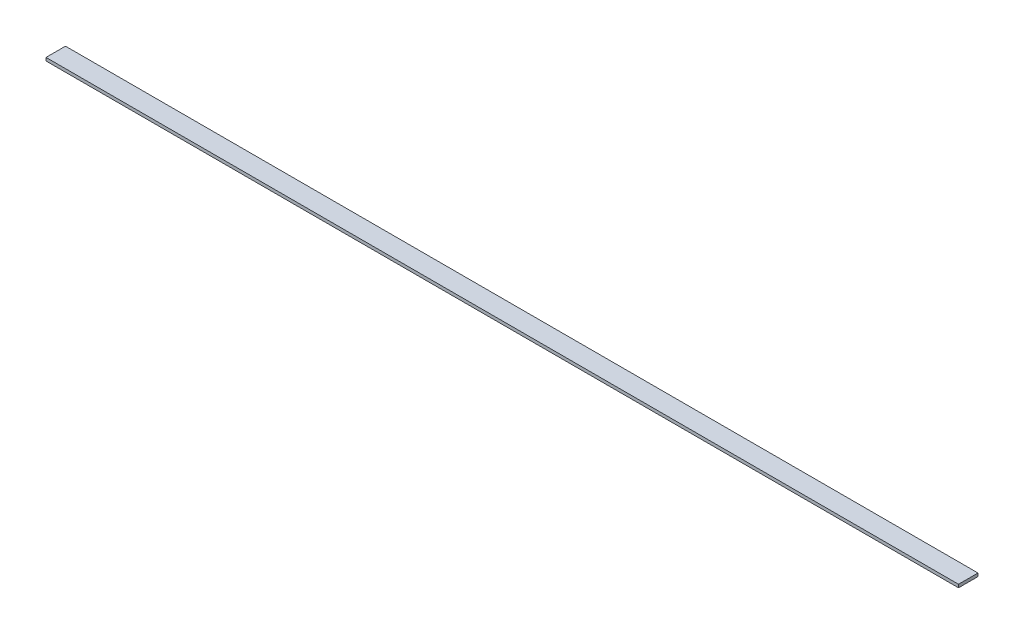
ISO-10303-21;
HEADER;
FILE_DESCRIPTION(('STEP AP214'),'2;1');
FILE_NAME('part.step','',(''),(''),'','','');
FILE_SCHEMA(('AUTOMOTIVE_DESIGN { 1 0 10303 214 1 1 1 1 }'));
ENDSEC;
DATA;
#1=APPLICATION_CONTEXT('core data for automotive mechanical design processes');
#2=APPLICATION_PROTOCOL_DEFINITION('international standard','automotive_design',2000,#1);
#3=PRODUCT_CONTEXT('',#1,'mechanical');
#4=PRODUCT('Part','Part','',(#3));
#5=PRODUCT_RELATED_PRODUCT_CATEGORY('part','',(#4));
#6=PRODUCT_DEFINITION_FORMATION('','',#4);
#7=PRODUCT_DEFINITION_CONTEXT('part definition',#1,'design');
#8=PRODUCT_DEFINITION('design','',#6,#7);
#9=PRODUCT_DEFINITION_SHAPE('','',#8);
#10=(LENGTH_UNIT() NAMED_UNIT(*) SI_UNIT(.MILLI.,.METRE.));
#11=(NAMED_UNIT(*) PLANE_ANGLE_UNIT() SI_UNIT($,.RADIAN.));
#12=(NAMED_UNIT(*) SI_UNIT($,.STERADIAN.) SOLID_ANGLE_UNIT());
#13=UNCERTAINTY_MEASURE_WITH_UNIT(LENGTH_MEASURE(1.E-05),#10,'distance_accuracy_value','');
#14=(GEOMETRIC_REPRESENTATION_CONTEXT(3) GLOBAL_UNCERTAINTY_ASSIGNED_CONTEXT((#13)) GLOBAL_UNIT_ASSIGNED_CONTEXT((#10,
#11,#12)) REPRESENTATION_CONTEXT('',''));
#15=CARTESIAN_POINT('',(0.,0.,0.));
#16=DIRECTION('',(0.,0.,1.));
#17=DIRECTION('',(1.,0.,0.));
#18=AXIS2_PLACEMENT_3D('',#15,#16,#17);
#19=CARTESIAN_POINT('',(505.,2.,-12.5));
#20=DIRECTION('',(0.,0.,1.));
#21=DIRECTION('',(0.,-1.,0.));
#22=AXIS2_PLACEMENT_3D('',#19,#20,#21);
#23=PLANE('',#22);
#24=DIRECTION('',(-1.,0.,0.));
#25=VECTOR('',#24,1.);
#26=CARTESIAN_POINT('',(505.,-2.,-12.5));
#27=LINE('',#26,#25);
#28=CARTESIAN_POINT('',(505.,-2.,-12.5));
#29=VERTEX_POINT('',#28);
#30=CARTESIAN_POINT('',(-666.,-2.,-12.5));
#31=VERTEX_POINT('',#30);
#32=EDGE_CURVE('E91',#29,#31,#27,.T.);
#33=ORIENTED_EDGE('',*,*,#32,.T.);
#34=DIRECTION('',(0.,1.,0.));
#35=VECTOR('',#34,1.);
#36=CARTESIAN_POINT('',(-666.,2.,-12.5));
#37=LINE('',#36,#35);
#38=CARTESIAN_POINT('',(-666.,2.,-12.5));
#39=VERTEX_POINT('',#38);
#40=EDGE_CURVE('E86',#31,#39,#37,.T.);
#41=ORIENTED_EDGE('',*,*,#40,.T.);
#42=DIRECTION('',(-1.,0.,0.));
#43=VECTOR('',#42,1.);
#44=CARTESIAN_POINT('',(505.,2.,-12.5));
#45=LINE('',#44,#43);
#46=CARTESIAN_POINT('',(505.,2.,-12.5));
#47=VERTEX_POINT('',#46);
#48=EDGE_CURVE('E11',#47,#39,#45,.T.);
#49=ORIENTED_EDGE('',*,*,#48,.F.);
#50=DIRECTION('',(0.,1.,0.));
#51=VECTOR('',#50,1.);
#52=CARTESIAN_POINT('',(505.,2.,-12.5));
#53=LINE('',#52,#51);
#54=EDGE_CURVE('E97',#29,#47,#53,.T.);
#55=ORIENTED_EDGE('',*,*,#54,.F.);
#56=EDGE_LOOP('',(#33,#41,#49,#55));
#57=FACE_BOUND('',#56,.T.);
#58=ADVANCED_FACE('F34',(#57),#23,.F.);
#59=CARTESIAN_POINT('',(505.,2.,12.5));
#60=DIRECTION('',(0.,-1.,0.));
#61=DIRECTION('',(0.,0.,-1.));
#62=AXIS2_PLACEMENT_3D('',#59,#60,#61);
#63=PLANE('',#62);
#64=ORIENTED_EDGE('',*,*,#48,.T.);
#65=DIRECTION('',(0.,0.,1.));
#66=VECTOR('',#65,1.);
#67=CARTESIAN_POINT('',(-666.,2.,12.5));
#68=LINE('',#67,#66);
#69=CARTESIAN_POINT('',(-666.,2.,12.5));
#70=VERTEX_POINT('',#69);
#71=EDGE_CURVE('E76',#39,#70,#68,.T.);
#72=ORIENTED_EDGE('',*,*,#71,.T.);
#73=DIRECTION('',(-1.,0.,0.));
#74=VECTOR('',#73,1.);
#75=CARTESIAN_POINT('',(505.,2.,12.5));
#76=LINE('',#75,#74);
#77=CARTESIAN_POINT('',(505.,2.,12.5));
#78=VERTEX_POINT('',#77);
#79=EDGE_CURVE('E41',#78,#70,#76,.T.);
#80=ORIENTED_EDGE('',*,*,#79,.F.);
#81=DIRECTION('',(0.,0.,1.));
#82=VECTOR('',#81,1.);
#83=CARTESIAN_POINT('',(505.,2.,12.5));
#84=LINE('',#83,#82);
#85=EDGE_CURVE('E77',#47,#78,#84,.T.);
#86=ORIENTED_EDGE('',*,*,#85,.F.);
#87=EDGE_LOOP('',(#64,#72,#80,#86));
#88=FACE_BOUND('',#87,.T.);
#89=ADVANCED_FACE('F74',(#88),#63,.F.);
#90=CARTESIAN_POINT('',(505.,2.,12.5));
#91=DIRECTION('',(0.,0.,-1.));
#92=DIRECTION('',(0.,1.,0.));
#93=AXIS2_PLACEMENT_3D('',#90,#91,#92);
#94=PLANE('',#93);
#95=ORIENTED_EDGE('',*,*,#79,.T.);
#96=DIRECTION('',(0.,-1.,0.));
#97=VECTOR('',#96,1.);
#98=CARTESIAN_POINT('',(-666.,2.,12.5));
#99=LINE('',#98,#97);
#100=CARTESIAN_POINT('',(-666.,-2.,12.5));
#101=VERTEX_POINT('',#100);
#102=EDGE_CURVE('E89',#70,#101,#99,.T.);
#103=ORIENTED_EDGE('',*,*,#102,.T.);
#104=DIRECTION('',(-1.,0.,0.));
#105=VECTOR('',#104,1.);
#106=CARTESIAN_POINT('',(505.,-2.,12.5));
#107=LINE('',#106,#105);
#108=CARTESIAN_POINT('',(505.,-2.,12.5));
#109=VERTEX_POINT('',#108);
#110=EDGE_CURVE('E103',#109,#101,#107,.T.);
#111=ORIENTED_EDGE('',*,*,#110,.F.);
#112=DIRECTION('',(0.,-1.,0.));
#113=VECTOR('',#112,1.);
#114=CARTESIAN_POINT('',(505.,2.,12.5));
#115=LINE('',#114,#113);
#116=EDGE_CURVE('E53',#78,#109,#115,.T.);
#117=ORIENTED_EDGE('',*,*,#116,.F.);
#118=EDGE_LOOP('',(#95,#103,#111,#117));
#119=FACE_BOUND('',#118,.T.);
#120=ADVANCED_FACE('F105',(#119),#94,.F.);
#121=CARTESIAN_POINT('',(505.,-2.,12.5));
#122=DIRECTION('',(0.,1.,0.));
#123=DIRECTION('',(0.,0.,1.));
#124=AXIS2_PLACEMENT_3D('',#121,#122,#123);
#125=PLANE('',#124);
#126=ORIENTED_EDGE('',*,*,#110,.T.);
#127=DIRECTION('',(0.,0.,-1.));
#128=VECTOR('',#127,1.);
#129=CARTESIAN_POINT('',(-666.,-2.,12.5));
#130=LINE('',#129,#128);
#131=EDGE_CURVE('E95',#101,#31,#130,.T.);
#132=ORIENTED_EDGE('',*,*,#131,.T.);
#133=ORIENTED_EDGE('',*,*,#32,.F.);
#134=DIRECTION('',(0.,0.,-1.));
#135=VECTOR('',#134,1.);
#136=CARTESIAN_POINT('',(505.,-2.,12.5));
#137=LINE('',#136,#135);
#138=EDGE_CURVE('E48',#109,#29,#137,.T.);
#139=ORIENTED_EDGE('',*,*,#138,.F.);
#140=EDGE_LOOP('',(#126,#132,#133,#139));
#141=FACE_BOUND('',#140,.T.);
#142=ADVANCED_FACE('F107',(#141),#125,.F.);
#143=CARTESIAN_POINT('',(505.,-2.,-12.5));
#144=DIRECTION('',(1.,0.,0.));
#145=DIRECTION('',(0.,0.,-1.));
#146=AXIS2_PLACEMENT_3D('',#143,#144,#145);
#147=PLANE('',#146);
#148=ORIENTED_EDGE('',*,*,#54,.T.);
#149=ORIENTED_EDGE('',*,*,#85,.T.);
#150=ORIENTED_EDGE('',*,*,#116,.T.);
#151=ORIENTED_EDGE('',*,*,#138,.T.);
#152=EDGE_LOOP('',(#148,#149,#150,#151));
#153=FACE_BOUND('',#152,.T.);
#154=ADVANCED_FACE('F108',(#153),#147,.T.);
#155=CARTESIAN_POINT('',(-666.,-2.,-12.5));
#156=DIRECTION('',(1.,0.,0.));
#157=DIRECTION('',(0.,0.,-1.));
#158=AXIS2_PLACEMENT_3D('',#155,#156,#157);
#159=PLANE('',#158);
#160=ORIENTED_EDGE('',*,*,#40,.F.);
#161=ORIENTED_EDGE('',*,*,#131,.F.);
#162=ORIENTED_EDGE('',*,*,#102,.F.);
#163=ORIENTED_EDGE('',*,*,#71,.F.);
#164=EDGE_LOOP('',(#160,#161,#162,#163));
#165=FACE_BOUND('',#164,.T.);
#166=ADVANCED_FACE('F84',(#165),#159,.F.);
#167=CLOSED_SHELL('',(#58,#89,#120,#142,#154,#166));
#168=MANIFOLD_SOLID_BREP('B2',#167);
#169=ADVANCED_BREP_SHAPE_REPRESENTATION('',(#18,#168),#14);
#170=SHAPE_DEFINITION_REPRESENTATION(#9,#169);
ENDSEC;
END-ISO-10303-21;
